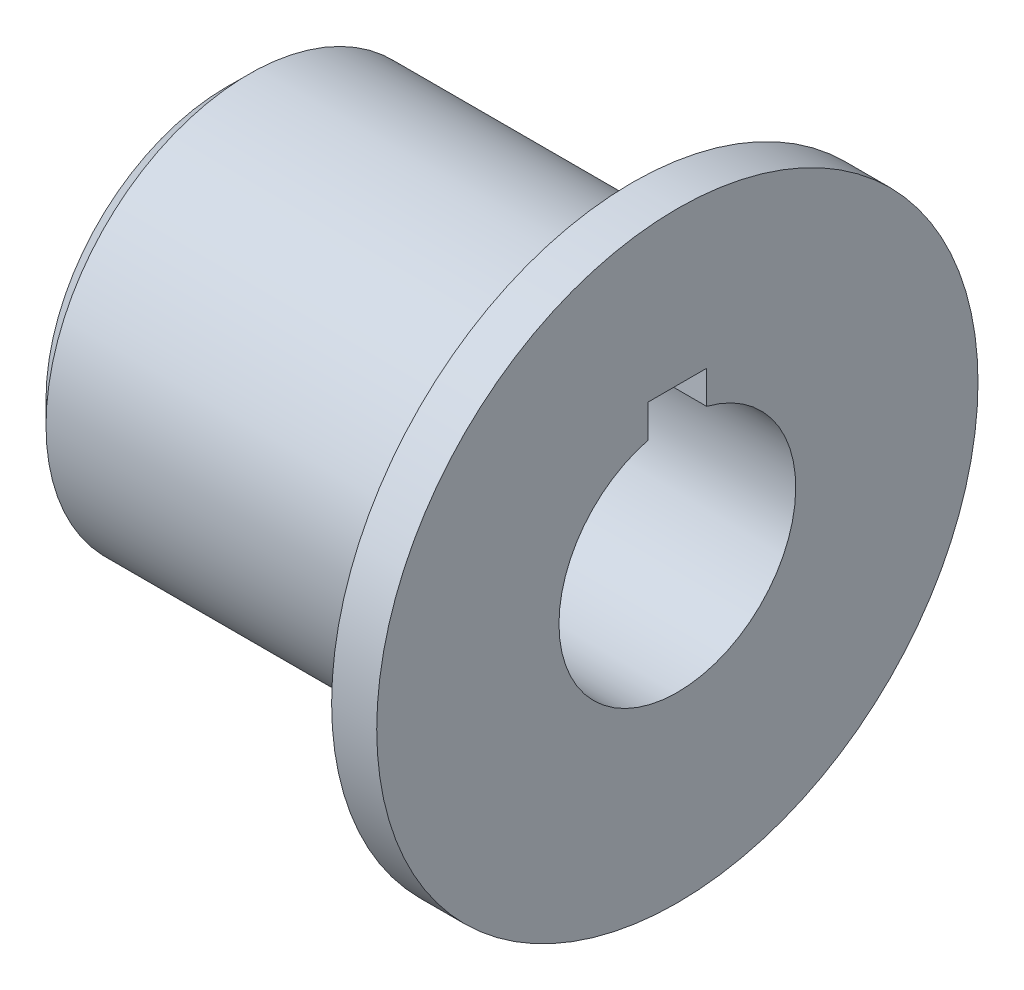
ISO-10303-21;
HEADER;
FILE_DESCRIPTION(('STEP AP214'),'2;1');
FILE_NAME('part.step','',(''),(''),'','','');
FILE_SCHEMA(('AUTOMOTIVE_DESIGN { 1 0 10303 214 1 1 1 1 }'));
ENDSEC;
DATA;
#1=APPLICATION_CONTEXT('core data for automotive mechanical design processes');
#2=APPLICATION_PROTOCOL_DEFINITION('international standard','automotive_design',2000,#1);
#3=PRODUCT_CONTEXT('',#1,'mechanical');
#4=PRODUCT('Part','Part','',(#3));
#5=PRODUCT_RELATED_PRODUCT_CATEGORY('part','',(#4));
#6=PRODUCT_DEFINITION_FORMATION('','',#4);
#7=PRODUCT_DEFINITION_CONTEXT('part definition',#1,'design');
#8=PRODUCT_DEFINITION('design','',#6,#7);
#9=PRODUCT_DEFINITION_SHAPE('','',#8);
#10=(LENGTH_UNIT() NAMED_UNIT(*) SI_UNIT(.MILLI.,.METRE.));
#11=(NAMED_UNIT(*) PLANE_ANGLE_UNIT() SI_UNIT($,.RADIAN.));
#12=(NAMED_UNIT(*) SI_UNIT($,.STERADIAN.) SOLID_ANGLE_UNIT());
#13=UNCERTAINTY_MEASURE_WITH_UNIT(LENGTH_MEASURE(1.E-05),#10,'distance_accuracy_value','');
#14=(GEOMETRIC_REPRESENTATION_CONTEXT(3) GLOBAL_UNCERTAINTY_ASSIGNED_CONTEXT((#13)) GLOBAL_UNIT_ASSIGNED_CONTEXT((#10,
#11,#12)) REPRESENTATION_CONTEXT('',''));
#15=CARTESIAN_POINT('',(0.,0.,0.));
#16=DIRECTION('',(0.,0.,1.));
#17=DIRECTION('',(1.,0.,0.));
#18=AXIS2_PLACEMENT_3D('',#15,#16,#17);
#19=CARTESIAN_POINT('',(15.24,10.16,0.));
#20=DIRECTION('',(-1.,0.,0.));
#21=DIRECTION('',(0.,0.,1.));
#22=AXIS2_PLACEMENT_3D('',#19,#20,#21);
#23=PLANE('',#22);
#24=CARTESIAN_POINT('',(15.24,0.,0.));
#25=DIRECTION('',(-1.,0.,0.));
#26=DIRECTION('',(0.,0.,1.));
#27=AXIS2_PLACEMENT_3D('',#24,#25,#26);
#28=CIRCLE('',#27,10.16);
#29=CARTESIAN_POINT('',(15.24,0.,10.16));
#30=VERTEX_POINT('',#29);
#31=EDGE_CURVE('E172',#30,#30,#28,.T.);
#32=ORIENTED_EDGE('',*,*,#31,.F.);
#33=EDGE_LOOP('',(#32));
#34=FACE_BOUND('',#33,.T.);
#35=DIRECTION('',(0.,1.,0.));
#36=VECTOR('',#35,1.);
#37=CARTESIAN_POINT('',(15.24,4.9911,-0.9906));
#38=LINE('',#37,#36);
#39=CARTESIAN_POINT('',(15.24,3.87591432954858,-0.9906));
#40=VERTEX_POINT('',#39);
#41=CARTESIAN_POINT('',(15.24,4.9911,-0.9906));
#42=VERTEX_POINT('',#41);
#43=EDGE_CURVE('E82',#40,#42,#38,.T.);
#44=ORIENTED_EDGE('',*,*,#43,.F.);
#45=CARTESIAN_POINT('',(15.24,0.,0.));
#46=DIRECTION('',(-1.,0.,0.));
#47=DIRECTION('',(0.,0.,1.));
#48=AXIS2_PLACEMENT_3D('',#45,#46,#47);
#49=CIRCLE('',#48,4.0005);
#50=CARTESIAN_POINT('',(15.24,3.87591432954858,0.9906));
#51=VERTEX_POINT('',#50);
#52=EDGE_CURVE('E174',#40,#51,#49,.T.);
#53=ORIENTED_EDGE('',*,*,#52,.T.);
#54=DIRECTION('',(0.,1.,0.));
#55=VECTOR('',#54,1.);
#56=CARTESIAN_POINT('',(15.24,4.9911,0.9906));
#57=LINE('',#56,#55);
#58=CARTESIAN_POINT('',(15.24,4.9911,0.9906));
#59=VERTEX_POINT('',#58);
#60=EDGE_CURVE('E53',#51,#59,#57,.T.);
#61=ORIENTED_EDGE('',*,*,#60,.T.);
#62=DIRECTION('',(0.,0.,1.));
#63=VECTOR('',#62,1.);
#64=CARTESIAN_POINT('',(15.24,4.9911,-0.9906));
#65=LINE('',#64,#63);
#66=EDGE_CURVE('E97',#42,#59,#65,.T.);
#67=ORIENTED_EDGE('',*,*,#66,.F.);
#68=EDGE_LOOP('',(#44,#53,#61,#67));
#69=FACE_BOUND('',#68,.T.);
#70=ADVANCED_FACE('F38',(#34,#69),#23,.F.);
#71=CARTESIAN_POINT('',(0.,0.,0.));
#72=DIRECTION('',(-1.,0.,0.));
#73=DIRECTION('',(0.,0.,1.));
#74=AXIS2_PLACEMENT_3D('',#71,#72,#73);
#75=CYLINDRICAL_SURFACE('',#74,4.0005);
#76=CARTESIAN_POINT('',(9.525,0.,0.));
#77=DIRECTION('',(-1.,0.,0.));
#78=DIRECTION('',(0.,0.,1.));
#79=AXIS2_PLACEMENT_3D('',#76,#77,#78);
#80=CIRCLE('',#79,4.0005);
#81=CARTESIAN_POINT('',(9.525,0.,4.0005));
#82=VERTEX_POINT('',#81);
#83=EDGE_CURVE('E116',#82,#82,#80,.T.);
#84=ORIENTED_EDGE('',*,*,#83,.T.);
#85=EDGE_LOOP('',(#84));
#86=FACE_BOUND('',#85,.T.);
#87=DIRECTION('',(-1.,0.,0.));
#88=VECTOR('',#87,1.);
#89=CARTESIAN_POINT('',(0.,3.87591432954858,-0.9906));
#90=LINE('',#89,#88);
#91=CARTESIAN_POINT('',(9.55577030537274,3.87591432954858,-0.9906));
#92=VERTEX_POINT('',#91);
#93=EDGE_CURVE('E87',#92,#40,#90,.F.);
#94=ORIENTED_EDGE('',*,*,#93,.F.);
#95=CARTESIAN_POINT('',(9.55577030537274,3.87591432954858,-0.9906));
#96=CARTESIAN_POINT('',(9.57015356974522,3.89997137560666,-0.896515241758494));
#97=CARTESIAN_POINT('',(9.58304758879891,3.92064560817447,-0.80129963430613));
#98=CARTESIAN_POINT('',(9.60506200213654,3.95505801032205,-0.609123524538393));
#99=CARTESIAN_POINT('',(9.61417952013428,3.96879089492918,-0.512161750726645));
#100=CARTESIAN_POINT('',(9.62765262458,3.98886148314297,-0.319568698292738));
#101=CARTESIAN_POINT('',(9.63212050726327,3.99537384180673,-0.223963903959853));
#102=CARTESIAN_POINT('',(9.63633516126337,4.00151488568421,-0.0324959845287631));
#103=CARTESIAN_POINT('',(9.63608452029909,4.00114734395333,0.0633669701480269));
#104=CARTESIAN_POINT('',(9.6296535348651,3.99178032185551,0.298587898035485));
#105=CARTESIAN_POINT('',(9.62080911595906,3.97890327991198,0.437751416017347));
#106=CARTESIAN_POINT('',(9.60102277905271,3.94871956117474,0.645488619420195));
#107=CARTESIAN_POINT('',(9.59323715002569,3.93668305334399,0.715207773315616));
#108=CARTESIAN_POINT('',(9.57580837060194,3.908992562228,0.853669258623806));
#109=CARTESIAN_POINT('',(9.56616576559511,3.89333964080685,0.922411870495344));
#110=CARTESIAN_POINT('',(9.55577030537272,3.87591432954858,0.990599999999999));
#111=B_SPLINE_CURVE_WITH_KNOTS('',3,(#95,#96,#97,#98,#99,#100,#101,#102,#103,#104,#105,#106,
#107,#108,#109,#110),.UNSPECIFIED.,.F.,.F.,(4,2,2,2,2,2,2,4),(0.,0.29449369422359,
0.589211272268211,0.876632984970975,1.16389707529639,1.58277073841528,1.79620301612778,
2.0095727045708),.UNSPECIFIED.);
#112=CARTESIAN_POINT('',(9.55577030537274,3.87591432954858,0.9906));
#113=VERTEX_POINT('',#112);
#114=EDGE_CURVE('E61',#92,#113,#111,.T.);
#115=ORIENTED_EDGE('',*,*,#114,.T.);
#116=DIRECTION('',(-1.,0.,0.));
#117=VECTOR('',#116,1.);
#118=CARTESIAN_POINT('',(0.,3.87591432954858,0.9906));
#119=LINE('',#118,#117);
#120=EDGE_CURVE('E102',#113,#51,#119,.F.);
#121=ORIENTED_EDGE('',*,*,#120,.T.);
#122=ORIENTED_EDGE('',*,*,#52,.F.);
#123=EDGE_LOOP('',(#94,#115,#121,#122));
#124=FACE_BOUND('',#123,.T.);
#125=ADVANCED_FACE('F118',(#86,#124),#75,.F.);
#126=CARTESIAN_POINT('',(0.,0.,0.));
#127=DIRECTION('',(1.,0.,0.));
#128=DIRECTION('',(0.,0.,-1.));
#129=AXIS2_PLACEMENT_3D('',#126,#127,#128);
#130=PLANE('',#129);
#131=CARTESIAN_POINT('',(0.,0.,0.));
#132=DIRECTION('',(1.,0.,0.));
#133=DIRECTION('',(0.,0.,-1.));
#134=AXIS2_PLACEMENT_3D('',#131,#132,#133);
#135=CIRCLE('',#134,6.096);
#136=CARTESIAN_POINT('',(0.,0.,-6.096));
#137=VERTEX_POINT('',#136);
#138=EDGE_CURVE('E46',#137,#137,#135,.F.);
#139=ORIENTED_EDGE('',*,*,#138,.T.);
#140=EDGE_LOOP('',(#139));
#141=FACE_BOUND('',#140,.T.);
#142=ADVANCED_FACE('F148',(#141),#130,.F.);
#143=CARTESIAN_POINT('',(0.,0.,0.));
#144=DIRECTION('',(-1.,0.,0.));
#145=DIRECTION('',(0.,0.,1.));
#146=AXIS2_PLACEMENT_3D('',#143,#144,#145);
#147=CYLINDRICAL_SURFACE('',#146,6.858);
#148=CARTESIAN_POINT('',(0.761999999999998,0.,0.));
#149=DIRECTION('',(1.,0.,0.));
#150=DIRECTION('',(0.,0.,-1.));
#151=AXIS2_PLACEMENT_3D('',#148,#149,#150);
#152=CIRCLE('',#151,6.858);
#153=CARTESIAN_POINT('',(0.761999999999998,0.,-6.858));
#154=VERTEX_POINT('',#153);
#155=EDGE_CURVE('E11',#154,#154,#152,.T.);
#156=ORIENTED_EDGE('',*,*,#155,.T.);
#157=EDGE_LOOP('',(#156));
#158=FACE_BOUND('',#157,.T.);
#159=CARTESIAN_POINT('',(13.716,0.,0.));
#160=DIRECTION('',(-1.,0.,0.));
#161=DIRECTION('',(0.,0.,1.));
#162=AXIS2_PLACEMENT_3D('',#159,#160,#161);
#163=CIRCLE('',#162,6.858);
#164=CARTESIAN_POINT('',(13.716,0.,6.858));
#165=VERTEX_POINT('',#164);
#166=EDGE_CURVE('E165',#165,#165,#163,.T.);
#167=ORIENTED_EDGE('',*,*,#166,.T.);
#168=EDGE_LOOP('',(#167));
#169=FACE_BOUND('',#168,.T.);
#170=ADVANCED_FACE('F154',(#158,#169),#147,.T.);
#171=CARTESIAN_POINT('',(13.716,6.858,0.));
#172=DIRECTION('',(1.,0.,0.));
#173=DIRECTION('',(0.,0.,-1.));
#174=AXIS2_PLACEMENT_3D('',#171,#172,#173);
#175=PLANE('',#174);
#176=ORIENTED_EDGE('',*,*,#166,.F.);
#177=EDGE_LOOP('',(#176));
#178=FACE_BOUND('',#177,.T.);
#179=CARTESIAN_POINT('',(13.716,0.,0.));
#180=DIRECTION('',(-1.,0.,0.));
#181=DIRECTION('',(0.,0.,1.));
#182=AXIS2_PLACEMENT_3D('',#179,#180,#181);
#183=CIRCLE('',#182,10.16);
#184=CARTESIAN_POINT('',(13.716,0.,10.16));
#185=VERTEX_POINT('',#184);
#186=EDGE_CURVE('E167',#185,#185,#183,.T.);
#187=ORIENTED_EDGE('',*,*,#186,.T.);
#188=EDGE_LOOP('',(#187));
#189=FACE_BOUND('',#188,.T.);
#190=ADVANCED_FACE('F139',(#178,#189),#175,.F.);
#191=CARTESIAN_POINT('',(0.,0.,0.));
#192=DIRECTION('',(-1.,0.,0.));
#193=DIRECTION('',(0.,0.,1.));
#194=AXIS2_PLACEMENT_3D('',#191,#192,#193);
#195=CYLINDRICAL_SURFACE('',#194,10.16);
#196=ORIENTED_EDGE('',*,*,#186,.F.);
#197=EDGE_LOOP('',(#196));
#198=FACE_BOUND('',#197,.T.);
#199=ORIENTED_EDGE('',*,*,#31,.T.);
#200=EDGE_LOOP('',(#199));
#201=FACE_BOUND('',#200,.T.);
#202=ADVANCED_FACE('F132',(#198,#201),#195,.T.);
#203=CARTESIAN_POINT('',(9.525,4.0005,0.));
#204=DIRECTION('',(-1.,0.,0.));
#205=DIRECTION('',(0.,0.,1.));
#206=AXIS2_PLACEMENT_3D('',#203,#204,#205);
#207=PLANE('',#206);
#208=ORIENTED_EDGE('',*,*,#83,.F.);
#209=EDGE_LOOP('',(#208));
#210=FACE_BOUND('',#209,.T.);
#211=ADVANCED_FACE('F130',(#210),#207,.F.);
#212=CARTESIAN_POINT('',(0.,0.,0.));
#213=DIRECTION('',(1.,0.,0.));
#214=DIRECTION('',(0.,0.,-1.));
#215=AXIS2_PLACEMENT_3D('',#212,#213,#214);
#216=CONICAL_SURFACE('',#215,6.096,0.785398163397449);
#217=ORIENTED_EDGE('',*,*,#155,.F.);
#218=EDGE_LOOP('',(#217));
#219=FACE_BOUND('',#218,.T.);
#220=ORIENTED_EDGE('',*,*,#138,.F.);
#221=EDGE_LOOP('',(#220));
#222=FACE_BOUND('',#221,.T.);
#223=ADVANCED_FACE('F40',(#219,#222),#216,.T.);
#224=CARTESIAN_POINT('',(11.5191831009213,2.7051,-0.9906));
#225=DIRECTION('',(0.,0.,1.));
#226=DIRECTION('',(1.,0.,0.));
#227=AXIS2_PLACEMENT_3D('',#224,#225,#226);
#228=CYLINDRICAL_SURFACE('',#227,2.286);
#229=CARTESIAN_POINT('',(11.5191831009213,2.7051,-0.9906));
#230=DIRECTION('',(0.,0.,1.));
#231=DIRECTION('',(1.,0.,0.));
#232=AXIS2_PLACEMENT_3D('',#229,#230,#231);
#233=CIRCLE('',#232,2.286);
#234=CARTESIAN_POINT('',(11.5191831009213,4.9911,-0.9906));
#235=VERTEX_POINT('',#234);
#236=EDGE_CURVE('E99',#235,#92,#233,.T.);
#237=ORIENTED_EDGE('',*,*,#236,.F.);
#238=DIRECTION('',(0.,0.,1.));
#239=VECTOR('',#238,1.);
#240=CARTESIAN_POINT('',(11.5191831009213,4.9911,-0.9906));
#241=LINE('',#240,#239);
#242=CARTESIAN_POINT('',(11.5191831009213,4.9911,0.9906));
#243=VERTEX_POINT('',#242);
#244=EDGE_CURVE('E98',#235,#243,#241,.T.);
#245=ORIENTED_EDGE('',*,*,#244,.T.);
#246=CARTESIAN_POINT('',(11.5191831009213,2.7051,0.9906));
#247=DIRECTION('',(0.,0.,1.));
#248=DIRECTION('',(1.,0.,0.));
#249=AXIS2_PLACEMENT_3D('',#246,#247,#248);
#250=CIRCLE('',#249,2.286);
#251=EDGE_CURVE('E92',#243,#113,#250,.T.);
#252=ORIENTED_EDGE('',*,*,#251,.T.);
#253=ORIENTED_EDGE('',*,*,#114,.F.);
#254=EDGE_LOOP('',(#237,#245,#252,#253));
#255=FACE_BOUND('',#254,.T.);
#256=ADVANCED_FACE('F122',(#255),#228,.F.);
#257=CARTESIAN_POINT('',(11.5191831009213,2.7051,-0.9906));
#258=DIRECTION('',(0.,0.,1.));
#259=DIRECTION('',(1.,0.,0.));
#260=AXIS2_PLACEMENT_3D('',#257,#258,#259);
#261=PLANE('',#260);
#262=ORIENTED_EDGE('',*,*,#93,.T.);
#263=ORIENTED_EDGE('',*,*,#43,.T.);
#264=DIRECTION('',(-1.,0.,0.));
#265=VECTOR('',#264,1.);
#266=CARTESIAN_POINT('',(15.24,4.9911,-0.9906));
#267=LINE('',#266,#265);
#268=EDGE_CURVE('E85',#42,#235,#267,.T.);
#269=ORIENTED_EDGE('',*,*,#268,.T.);
#270=ORIENTED_EDGE('',*,*,#236,.T.);
#271=EDGE_LOOP('',(#262,#263,#269,#270));
#272=FACE_BOUND('',#271,.T.);
#273=ADVANCED_FACE('F84',(#272),#261,.T.);
#274=CARTESIAN_POINT('',(11.5191831009213,2.7051,0.9906));
#275=DIRECTION('',(0.,0.,1.));
#276=DIRECTION('',(1.,0.,0.));
#277=AXIS2_PLACEMENT_3D('',#274,#275,#276);
#278=PLANE('',#277);
#279=ORIENTED_EDGE('',*,*,#251,.F.);
#280=DIRECTION('',(-1.,0.,0.));
#281=VECTOR('',#280,1.);
#282=CARTESIAN_POINT('',(15.24,4.9911,0.9906));
#283=LINE('',#282,#281);
#284=EDGE_CURVE('E178',#59,#243,#283,.T.);
#285=ORIENTED_EDGE('',*,*,#284,.F.);
#286=ORIENTED_EDGE('',*,*,#60,.F.);
#287=ORIENTED_EDGE('',*,*,#120,.F.);
#288=EDGE_LOOP('',(#279,#285,#286,#287));
#289=FACE_BOUND('',#288,.T.);
#290=ADVANCED_FACE('F127',(#289),#278,.F.);
#291=CARTESIAN_POINT('',(15.24,4.9911,-0.9906));
#292=DIRECTION('',(0.,1.,0.));
#293=DIRECTION('',(0.,0.,1.));
#294=AXIS2_PLACEMENT_3D('',#291,#292,#293);
#295=PLANE('',#294);
#296=ORIENTED_EDGE('',*,*,#284,.T.);
#297=ORIENTED_EDGE('',*,*,#244,.F.);
#298=ORIENTED_EDGE('',*,*,#268,.F.);
#299=ORIENTED_EDGE('',*,*,#66,.T.);
#300=EDGE_LOOP('',(#296,#297,#298,#299));
#301=FACE_BOUND('',#300,.T.);
#302=ADVANCED_FACE('F96',(#301),#295,.F.);
#303=CLOSED_SHELL('',(#70,#125,#142,#170,#190,#202,#211,#223,#256,#273,#290,#302));
#304=MANIFOLD_SOLID_BREP('B2',#303);
#305=ADVANCED_BREP_SHAPE_REPRESENTATION('',(#18,#304),#14);
#306=SHAPE_DEFINITION_REPRESENTATION(#9,#305);
ENDSEC;
END-ISO-10303-21;
